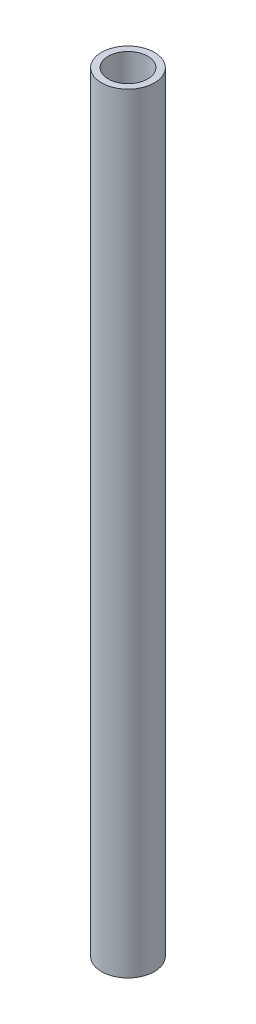
ISO-10303-21;
HEADER;
FILE_DESCRIPTION(('STEP AP214'),'2;1');
FILE_NAME('part.step','',(''),(''),'','','');
FILE_SCHEMA(('AUTOMOTIVE_DESIGN { 1 0 10303 214 1 1 1 1 }'));
ENDSEC;
DATA;
#1=APPLICATION_CONTEXT('core data for automotive mechanical design processes');
#2=APPLICATION_PROTOCOL_DEFINITION('international standard','automotive_design',2000,#1);
#3=PRODUCT_CONTEXT('',#1,'mechanical');
#4=PRODUCT('Part','Part','',(#3));
#5=PRODUCT_RELATED_PRODUCT_CATEGORY('part','',(#4));
#6=PRODUCT_DEFINITION_FORMATION('','',#4);
#7=PRODUCT_DEFINITION_CONTEXT('part definition',#1,'design');
#8=PRODUCT_DEFINITION('design','',#6,#7);
#9=PRODUCT_DEFINITION_SHAPE('','',#8);
#10=(LENGTH_UNIT() NAMED_UNIT(*) SI_UNIT(.MILLI.,.METRE.));
#11=(NAMED_UNIT(*) PLANE_ANGLE_UNIT() SI_UNIT($,.RADIAN.));
#12=(NAMED_UNIT(*) SI_UNIT($,.STERADIAN.) SOLID_ANGLE_UNIT());
#13=UNCERTAINTY_MEASURE_WITH_UNIT(LENGTH_MEASURE(1.E-05),#10,'distance_accuracy_value','');
#14=(GEOMETRIC_REPRESENTATION_CONTEXT(3) GLOBAL_UNCERTAINTY_ASSIGNED_CONTEXT((#13)) GLOBAL_UNIT_ASSIGNED_CONTEXT((#10,
#11,#12)) REPRESENTATION_CONTEXT('',''));
#15=CARTESIAN_POINT('',(0.,0.,0.));
#16=DIRECTION('',(0.,0.,1.));
#17=DIRECTION('',(1.,0.,0.));
#18=AXIS2_PLACEMENT_3D('',#15,#16,#17);
#19=CARTESIAN_POINT('',(0.,115.,0.));
#20=DIRECTION('',(0.,1.,0.));
#21=DIRECTION('',(0.,0.,1.));
#22=AXIS2_PLACEMENT_3D('',#19,#20,#21);
#23=PLANE('',#22);
#24=CARTESIAN_POINT('',(0.,115.,0.));
#25=DIRECTION('',(0.,1.,0.));
#26=DIRECTION('',(0.,0.,1.));
#27=AXIS2_PLACEMENT_3D('',#24,#25,#26);
#28=CIRCLE('',#27,3.95);
#29=CARTESIAN_POINT('',(0.,115.,3.95));
#30=VERTEX_POINT('',#29);
#31=EDGE_CURVE('E10',#30,#30,#28,.T.);
#32=ORIENTED_EDGE('',*,*,#31,.T.);
#33=EDGE_LOOP('',(#32));
#34=FACE_BOUND('',#33,.T.);
#35=CARTESIAN_POINT('',(0.,115.,0.));
#36=DIRECTION('',(0.,1.,0.));
#37=DIRECTION('',(0.,0.,1.));
#38=AXIS2_PLACEMENT_3D('',#35,#36,#37);
#39=CIRCLE('',#38,2.95);
#40=CARTESIAN_POINT('',(0.,115.,2.95));
#41=VERTEX_POINT('',#40);
#42=EDGE_CURVE('E57',#41,#41,#39,.T.);
#43=ORIENTED_EDGE('',*,*,#42,.F.);
#44=EDGE_LOOP('',(#43));
#45=FACE_BOUND('',#44,.T.);
#46=ADVANCED_FACE('F44',(#34,#45),#23,.T.);
#47=CARTESIAN_POINT('',(0.,0.,0.));
#48=DIRECTION('',(0.,1.,0.));
#49=DIRECTION('',(0.,0.,1.));
#50=AXIS2_PLACEMENT_3D('',#47,#48,#49);
#51=PLANE('',#50);
#52=CARTESIAN_POINT('',(0.,0.,0.));
#53=DIRECTION('',(0.,1.,0.));
#54=DIRECTION('',(0.,0.,1.));
#55=AXIS2_PLACEMENT_3D('',#52,#53,#54);
#56=CIRCLE('',#55,3.95);
#57=CARTESIAN_POINT('',(0.,0.,3.95));
#58=VERTEX_POINT('',#57);
#59=EDGE_CURVE('E48',#58,#58,#56,.T.);
#60=ORIENTED_EDGE('',*,*,#59,.F.);
#61=EDGE_LOOP('',(#60));
#62=FACE_BOUND('',#61,.T.);
#63=CARTESIAN_POINT('',(0.,0.,0.));
#64=DIRECTION('',(0.,1.,0.));
#65=DIRECTION('',(0.,0.,1.));
#66=AXIS2_PLACEMENT_3D('',#63,#64,#65);
#67=CIRCLE('',#66,2.95);
#68=CARTESIAN_POINT('',(0.,0.,2.95));
#69=VERTEX_POINT('',#68);
#70=EDGE_CURVE('E59',#69,#69,#67,.T.);
#71=ORIENTED_EDGE('',*,*,#70,.T.);
#72=EDGE_LOOP('',(#71));
#73=FACE_BOUND('',#72,.T.);
#74=ADVANCED_FACE('F71',(#62,#73),#51,.F.);
#75=CARTESIAN_POINT('',(0.,115.,0.));
#76=DIRECTION('',(0.,-1.,0.));
#77=DIRECTION('',(0.,0.,-1.));
#78=AXIS2_PLACEMENT_3D('',#75,#76,#77);
#79=CYLINDRICAL_SURFACE('',#78,3.95);
#80=ORIENTED_EDGE('',*,*,#31,.F.);
#81=EDGE_LOOP('',(#80));
#82=FACE_BOUND('',#81,.T.);
#83=ORIENTED_EDGE('',*,*,#59,.T.);
#84=EDGE_LOOP('',(#83));
#85=FACE_BOUND('',#84,.T.);
#86=ADVANCED_FACE('F46',(#82,#85),#79,.T.);
#87=CARTESIAN_POINT('',(0.,115.,0.));
#88=DIRECTION('',(0.,-1.,0.));
#89=DIRECTION('',(0.,0.,-1.));
#90=AXIS2_PLACEMENT_3D('',#87,#88,#89);
#91=CYLINDRICAL_SURFACE('',#90,2.95);
#92=ORIENTED_EDGE('',*,*,#42,.T.);
#93=EDGE_LOOP('',(#92));
#94=FACE_BOUND('',#93,.T.);
#95=ORIENTED_EDGE('',*,*,#70,.F.);
#96=EDGE_LOOP('',(#95));
#97=FACE_BOUND('',#96,.T.);
#98=ADVANCED_FACE('F67',(#94,#97),#91,.F.);
#99=CLOSED_SHELL('',(#46,#74,#86,#98));
#100=MANIFOLD_SOLID_BREP('B2',#99);
#101=ADVANCED_BREP_SHAPE_REPRESENTATION('',(#18,#100),#14);
#102=SHAPE_DEFINITION_REPRESENTATION(#9,#101);
ENDSEC;
END-ISO-10303-21;
